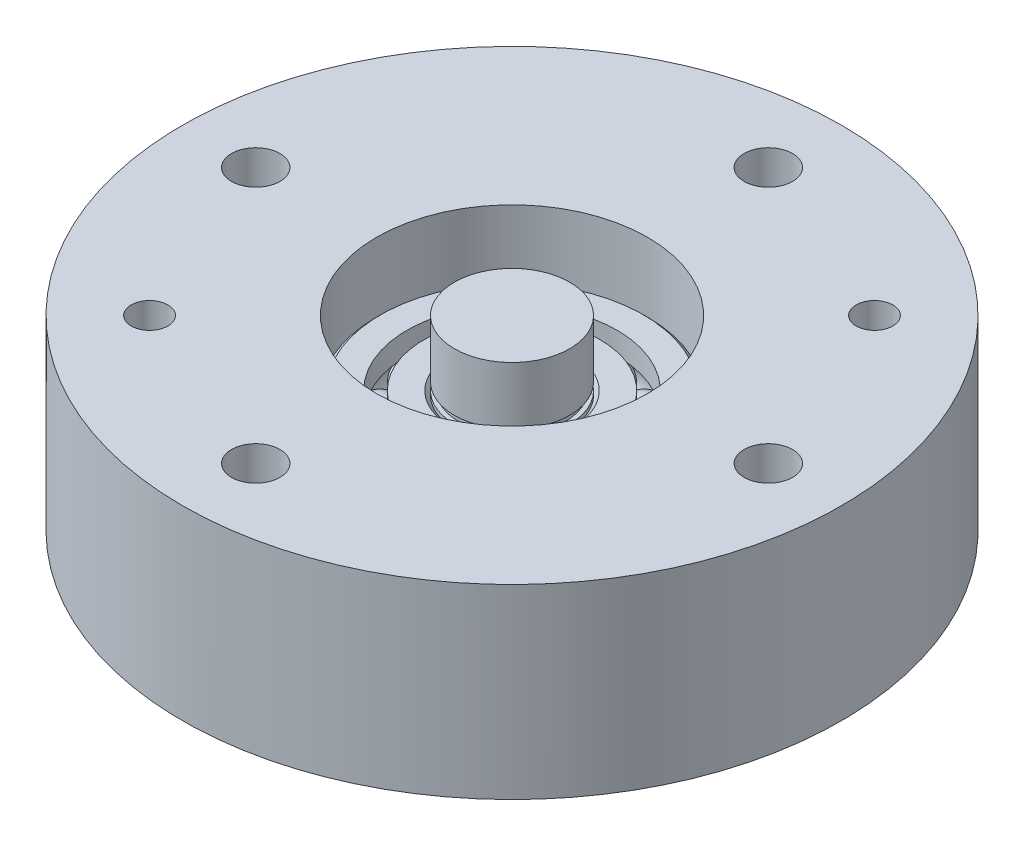
ISO-10303-21;
HEADER;
FILE_DESCRIPTION(('STEP AP214'),'2;1');
FILE_NAME('part.step','',(''),(''),'','','');
FILE_SCHEMA(('AUTOMOTIVE_DESIGN { 1 0 10303 214 1 1 1 1 }'));
ENDSEC;
DATA;
#1=APPLICATION_CONTEXT('core data for automotive mechanical design processes');
#2=APPLICATION_PROTOCOL_DEFINITION('international standard','automotive_design',2000,#1);
#3=PRODUCT_CONTEXT('',#1,'mechanical');
#4=PRODUCT('Part','Part','',(#3));
#5=PRODUCT_RELATED_PRODUCT_CATEGORY('part','',(#4));
#6=PRODUCT_DEFINITION_FORMATION('','',#4);
#7=PRODUCT_DEFINITION_CONTEXT('part definition',#1,'design');
#8=PRODUCT_DEFINITION('design','',#6,#7);
#9=PRODUCT_DEFINITION_SHAPE('','',#8);
#10=(LENGTH_UNIT() NAMED_UNIT(*) SI_UNIT(.MILLI.,.METRE.));
#11=(NAMED_UNIT(*) PLANE_ANGLE_UNIT() SI_UNIT($,.RADIAN.));
#12=(NAMED_UNIT(*) SI_UNIT($,.STERADIAN.) SOLID_ANGLE_UNIT());
#13=UNCERTAINTY_MEASURE_WITH_UNIT(LENGTH_MEASURE(1.E-05),#10,'distance_accuracy_value','');
#14=(GEOMETRIC_REPRESENTATION_CONTEXT(3) GLOBAL_UNCERTAINTY_ASSIGNED_CONTEXT((#13)) GLOBAL_UNIT_ASSIGNED_CONTEXT((#10,
#11,#12)) REPRESENTATION_CONTEXT('',''));
#15=CARTESIAN_POINT('',(0.,0.,0.));
#16=DIRECTION('',(0.,0.,1.));
#17=DIRECTION('',(1.,0.,0.));
#18=AXIS2_PLACEMENT_3D('',#15,#16,#17);
#19=CARTESIAN_POINT('',(0.,-53.5842712474619,0.));
#20=DIRECTION('',(0.,1.,0.));
#21=DIRECTION('',(0.,0.,1.));
#22=AXIS2_PLACEMENT_3D('',#19,#20,#21);
#23=CYLINDRICAL_SURFACE('',#22,10.);
#24=CARTESIAN_POINT('',(0.,-25.3,0.));
#25=DIRECTION('',(0.,1.,0.));
#26=DIRECTION('',(0.,0.,1.));
#27=AXIS2_PLACEMENT_3D('',#24,#25,#26);
#28=CIRCLE('',#27,10.);
#29=CARTESIAN_POINT('',(0.,-25.3,10.));
#30=VERTEX_POINT('',#29);
#31=EDGE_CURVE('E11',#30,#30,#28,.F.);
#32=ORIENTED_EDGE('',*,*,#31,.F.);
#33=EDGE_LOOP('',(#32));
#34=FACE_BOUND('',#33,.T.);
#35=CARTESIAN_POINT('',(0.,-11.3,0.));
#36=DIRECTION('',(0.,1.,0.));
#37=DIRECTION('',(0.,0.,1.));
#38=AXIS2_PLACEMENT_3D('',#35,#36,#37);
#39=CIRCLE('',#38,10.);
#40=CARTESIAN_POINT('',(0.,-11.3,10.));
#41=VERTEX_POINT('',#40);
#42=EDGE_CURVE('E48',#41,#41,#39,.T.);
#43=ORIENTED_EDGE('',*,*,#42,.F.);
#44=EDGE_LOOP('',(#43));
#45=FACE_BOUND('',#44,.T.);
#46=ADVANCED_FACE('F42',(#34,#45),#23,.T.);
#47=CARTESIAN_POINT('',(0.,-11.3,0.));
#48=DIRECTION('',(0.,1.,0.));
#49=DIRECTION('',(0.,0.,1.));
#50=AXIS2_PLACEMENT_3D('',#47,#48,#49);
#51=PLANE('',#50);
#52=CARTESIAN_POINT('',(0.,-11.3,0.));
#53=DIRECTION('',(0.,1.,0.));
#54=DIRECTION('',(0.,0.,1.));
#55=AXIS2_PLACEMENT_3D('',#52,#53,#54);
#56=CIRCLE('',#55,9.25);
#57=CARTESIAN_POINT('',(0.,-11.3,9.25));
#58=VERTEX_POINT('',#57);
#59=EDGE_CURVE('E64',#58,#58,#56,.T.);
#60=ORIENTED_EDGE('',*,*,#59,.F.);
#61=EDGE_LOOP('',(#60));
#62=FACE_BOUND('',#61,.T.);
#63=ORIENTED_EDGE('',*,*,#42,.T.);
#64=EDGE_LOOP('',(#63));
#65=FACE_BOUND('',#64,.T.);
#66=ADVANCED_FACE('F93',(#62,#65),#51,.T.);
#67=CARTESIAN_POINT('',(0.,-63.5038671967512,0.));
#68=DIRECTION('',(0.,1.,0.));
#69=DIRECTION('',(0.,0.,1.));
#70=AXIS2_PLACEMENT_3D('',#67,#68,#69);
#71=CYLINDRICAL_SURFACE('',#70,12.8);
#72=CARTESIAN_POINT('',(0.,-25.3,0.));
#73=DIRECTION('',(0.,-1.,0.));
#74=DIRECTION('',(0.,0.,-1.));
#75=AXIS2_PLACEMENT_3D('',#72,#73,#74);
#76=CIRCLE('',#75,12.8);
#77=CARTESIAN_POINT('',(0.,-25.3,-12.8));
#78=VERTEX_POINT('',#77);
#79=EDGE_CURVE('E56',#78,#78,#76,.T.);
#80=ORIENTED_EDGE('',*,*,#79,.T.);
#81=EDGE_LOOP('',(#80));
#82=FACE_BOUND('',#81,.T.);
#83=CARTESIAN_POINT('',(0.,-27.3,0.));
#84=DIRECTION('',(0.,-1.,0.));
#85=DIRECTION('',(0.,0.,-1.));
#86=AXIS2_PLACEMENT_3D('',#83,#84,#85);
#87=CIRCLE('',#86,12.8);
#88=CARTESIAN_POINT('',(0.,-27.3,-12.8));
#89=VERTEX_POINT('',#88);
#90=EDGE_CURVE('E52',#89,#89,#87,.T.);
#91=ORIENTED_EDGE('',*,*,#90,.F.);
#92=EDGE_LOOP('',(#91));
#93=FACE_BOUND('',#92,.T.);
#94=ADVANCED_FACE('F91',(#82,#93),#71,.T.);
#95=CARTESIAN_POINT('',(0.,-25.3,0.));
#96=DIRECTION('',(0.,-1.,0.));
#97=DIRECTION('',(0.,0.,-1.));
#98=AXIS2_PLACEMENT_3D('',#95,#96,#97);
#99=PLANE('',#98);
#100=ORIENTED_EDGE('',*,*,#31,.T.);
#101=EDGE_LOOP('',(#100));
#102=FACE_BOUND('',#101,.T.);
#103=ORIENTED_EDGE('',*,*,#79,.F.);
#104=EDGE_LOOP('',(#103));
#105=FACE_BOUND('',#104,.T.);
#106=ADVANCED_FACE('F87',(#102,#105),#99,.F.);
#107=CARTESIAN_POINT('',(0.,-27.3,0.));
#108=DIRECTION('',(0.,-1.,0.));
#109=DIRECTION('',(0.,0.,-1.));
#110=AXIS2_PLACEMENT_3D('',#107,#108,#109);
#111=PLANE('',#110);
#112=CARTESIAN_POINT('',(0.,-27.3,0.));
#113=DIRECTION('',(0.,-1.,0.));
#114=DIRECTION('',(0.,0.,-1.));
#115=AXIS2_PLACEMENT_3D('',#112,#113,#114);
#116=CIRCLE('',#115,7.75);
#117=CARTESIAN_POINT('',(0.,-27.3,-7.75));
#118=VERTEX_POINT('',#117);
#119=EDGE_CURVE('E76',#118,#118,#116,.T.);
#120=ORIENTED_EDGE('',*,*,#119,.F.);
#121=EDGE_LOOP('',(#120));
#122=FACE_BOUND('',#121,.T.);
#123=ORIENTED_EDGE('',*,*,#90,.T.);
#124=EDGE_LOOP('',(#123));
#125=FACE_BOUND('',#124,.T.);
#126=ADVANCED_FACE('F83',(#122,#125),#111,.T.);
#127=CARTESIAN_POINT('',(0.,16.1629509039023,0.));
#128=DIRECTION('',(0.,-1.,0.));
#129=DIRECTION('',(0.,0.,-1.));
#130=AXIS2_PLACEMENT_3D('',#127,#128,#129);
#131=CYLINDRICAL_SURFACE('',#130,9.25);
#132=ORIENTED_EDGE('',*,*,#59,.T.);
#133=EDGE_LOOP('',(#132));
#134=FACE_BOUND('',#133,.T.);
#135=CARTESIAN_POINT('',(0.,-10.,0.));
#136=DIRECTION('',(0.,1.,0.));
#137=DIRECTION('',(0.,0.,1.));
#138=AXIS2_PLACEMENT_3D('',#135,#136,#137);
#139=CIRCLE('',#138,9.25);
#140=CARTESIAN_POINT('',(0.,-10.,9.25));
#141=VERTEX_POINT('',#140);
#142=EDGE_CURVE('E61',#141,#141,#139,.T.);
#143=ORIENTED_EDGE('',*,*,#142,.F.);
#144=EDGE_LOOP('',(#143));
#145=FACE_BOUND('',#144,.T.);
#146=ADVANCED_FACE('F86',(#134,#145),#131,.T.);
#147=CARTESIAN_POINT('',(0.,28.2842712474619,0.));
#148=DIRECTION('',(0.,-1.,0.));
#149=DIRECTION('',(0.,0.,-1.));
#150=AXIS2_PLACEMENT_3D('',#147,#148,#149);
#151=CYLINDRICAL_SURFACE('',#150,10.);
#152=CARTESIAN_POINT('',(0.,-10.,0.));
#153=DIRECTION('',(0.,1.,0.));
#154=DIRECTION('',(0.,0.,1.));
#155=AXIS2_PLACEMENT_3D('',#152,#153,#154);
#156=CIRCLE('',#155,10.);
#157=CARTESIAN_POINT('',(0.,-10.,10.));
#158=VERTEX_POINT('',#157);
#159=EDGE_CURVE('E70',#158,#158,#156,.T.);
#160=ORIENTED_EDGE('',*,*,#159,.T.);
#161=EDGE_LOOP('',(#160));
#162=FACE_BOUND('',#161,.T.);
#163=CARTESIAN_POINT('',(0.,0.,0.));
#164=DIRECTION('',(0.,1.,0.));
#165=DIRECTION('',(0.,0.,1.));
#166=AXIS2_PLACEMENT_3D('',#163,#164,#165);
#167=CIRCLE('',#166,10.);
#168=CARTESIAN_POINT('',(0.,0.,10.));
#169=VERTEX_POINT('',#168);
#170=EDGE_CURVE('E67',#169,#169,#167,.T.);
#171=ORIENTED_EDGE('',*,*,#170,.F.);
#172=EDGE_LOOP('',(#171));
#173=FACE_BOUND('',#172,.T.);
#174=ADVANCED_FACE('F124',(#162,#173),#151,.T.);
#175=CARTESIAN_POINT('',(0.,-10.,0.));
#176=DIRECTION('',(0.,1.,0.));
#177=DIRECTION('',(0.,0.,1.));
#178=AXIS2_PLACEMENT_3D('',#175,#176,#177);
#179=PLANE('',#178);
#180=ORIENTED_EDGE('',*,*,#142,.T.);
#181=EDGE_LOOP('',(#180));
#182=FACE_BOUND('',#181,.T.);
#183=ORIENTED_EDGE('',*,*,#159,.F.);
#184=EDGE_LOOP('',(#183));
#185=FACE_BOUND('',#184,.T.);
#186=ADVANCED_FACE('F135',(#182,#185),#179,.F.);
#187=CARTESIAN_POINT('',(0.,0.,0.));
#188=DIRECTION('',(0.,1.,0.));
#189=DIRECTION('',(0.,0.,1.));
#190=AXIS2_PLACEMENT_3D('',#187,#188,#189);
#191=PLANE('',#190);
#192=ORIENTED_EDGE('',*,*,#170,.T.);
#193=EDGE_LOOP('',(#192));
#194=FACE_BOUND('',#193,.T.);
#195=ADVANCED_FACE('F145',(#194),#191,.T.);
#196=CARTESIAN_POINT('',(0.,-56.220310216783,0.));
#197=DIRECTION('',(0.,1.,0.));
#198=DIRECTION('',(0.,0.,1.));
#199=AXIS2_PLACEMENT_3D('',#196,#197,#198);
#200=CYLINDRICAL_SURFACE('',#199,7.75);
#201=ORIENTED_EDGE('',*,*,#119,.T.);
#202=EDGE_LOOP('',(#201));
#203=FACE_BOUND('',#202,.T.);
#204=CARTESIAN_POINT('',(0.,-34.3,0.));
#205=DIRECTION('',(0.,-1.,0.));
#206=DIRECTION('',(0.,0.,-1.));
#207=AXIS2_PLACEMENT_3D('',#204,#205,#206);
#208=CIRCLE('',#207,7.75);
#209=CARTESIAN_POINT('',(0.,-34.3,-7.75));
#210=VERTEX_POINT('',#209);
#211=EDGE_CURVE('E73',#210,#210,#208,.T.);
#212=ORIENTED_EDGE('',*,*,#211,.F.);
#213=EDGE_LOOP('',(#212));
#214=FACE_BOUND('',#213,.T.);
#215=ADVANCED_FACE('F80',(#203,#214),#200,.T.);
#216=CARTESIAN_POINT('',(0.,-34.3,0.));
#217=DIRECTION('',(0.,-1.,0.));
#218=DIRECTION('',(0.,0.,-1.));
#219=AXIS2_PLACEMENT_3D('',#216,#217,#218);
#220=PLANE('',#219);
#221=ORIENTED_EDGE('',*,*,#211,.T.);
#222=EDGE_LOOP('',(#221));
#223=FACE_BOUND('',#222,.T.);
#224=ADVANCED_FACE('F169',(#223),#220,.T.);
#225=CLOSED_SHELL('',(#46,#66,#94,#106,#126,#146,#174,#186,#195,#215,#224));
#226=MANIFOLD_SOLID_BREP('B2',#225);
#227=CARTESIAN_POINT('',(-8.37499999999981,-18.3,-14.5059255133895));
#228=DIRECTION('',(0.,1.,0.));
#229=DIRECTION('',(-0.499999999999989,0.,-0.866025403784445));
#230=AXIS2_PLACEMENT_3D('',#227,#228,#229);
#231=SPHERICAL_SURFACE('',#230,3.43265291781274);
#232=CARTESIAN_POINT('',(-8.37499999999981,-14.8673470821873,-14.5059255133895));
#233=VERTEX_POINT('',#232);
#234=VERTEX_LOOP('',#233);
#235=FACE_BOUND('',#234,.T.);
#236=ADVANCED_FACE('F209',(#235),#231,.T.);
#237=CLOSED_SHELL('',(#236));
#238=MANIFOLD_SOLID_BREP('B6',#237);
#239=CARTESIAN_POINT('',(-14.5059255133893,-18.3,-8.37500000000017));
#240=DIRECTION('',(0.,1.,0.));
#241=DIRECTION('',(-0.866025403784433,0.,-0.50000000000001));
#242=AXIS2_PLACEMENT_3D('',#239,#240,#241);
#243=SPHERICAL_SURFACE('',#242,3.43265291781274);
#244=CARTESIAN_POINT('',(-14.5059255133893,-14.8673470821873,-8.37500000000017));
#245=VERTEX_POINT('',#244);
#246=VERTEX_LOOP('',#245);
#247=FACE_BOUND('',#246,.T.);
#248=ADVANCED_FACE('F230',(#247),#243,.T.);
#249=CLOSED_SHELL('',(#248));
#250=MANIFOLD_SOLID_BREP('B38',#249);
#251=CARTESIAN_POINT('',(-16.75,-18.3,-1.80411241501588E-13));
#252=DIRECTION('',(0.,1.,0.));
#253=DIRECTION('',(-1.,0.,0.));
#254=AXIS2_PLACEMENT_3D('',#251,#252,#253);
#255=SPHERICAL_SURFACE('',#254,3.43265291781274);
#256=CARTESIAN_POINT('',(-16.75,-14.8673470821873,-1.80411241501588E-13));
#257=VERTEX_POINT('',#256);
#258=VERTEX_LOOP('',#257);
#259=FACE_BOUND('',#258,.T.);
#260=ADVANCED_FACE('F251',(#259),#255,.T.);
#261=CLOSED_SHELL('',(#260));
#262=MANIFOLD_SOLID_BREP('B205',#261);
#263=CARTESIAN_POINT('',(-14.5059255133894,-18.3,8.37499999999987));
#264=DIRECTION('',(0.,1.,0.));
#265=DIRECTION('',(-0.866025403784443,0.,0.499999999999992));
#266=AXIS2_PLACEMENT_3D('',#263,#264,#265);
#267=SPHERICAL_SURFACE('',#266,3.43265291781274);
#268=CARTESIAN_POINT('',(-14.5059255133894,-14.8673470821873,8.37499999999987));
#269=VERTEX_POINT('',#268);
#270=VERTEX_LOOP('',#269);
#271=FACE_BOUND('',#270,.T.);
#272=ADVANCED_FACE('F272',(#271),#267,.T.);
#273=CLOSED_SHELL('',(#272));
#274=MANIFOLD_SOLID_BREP('B226',#273);
#275=CARTESIAN_POINT('',(-8.37500000000012,-18.3,14.5059255133893));
#276=DIRECTION('',(0.,1.,0.));
#277=DIRECTION('',(-0.500000000000007,0.,0.866025403784435));
#278=AXIS2_PLACEMENT_3D('',#275,#276,#277);
#279=SPHERICAL_SURFACE('',#278,3.43265291781274);
#280=CARTESIAN_POINT('',(-8.37500000000012,-14.8673470821873,14.5059255133893));
#281=VERTEX_POINT('',#280);
#282=VERTEX_LOOP('',#281);
#283=FACE_BOUND('',#282,.T.);
#284=ADVANCED_FACE('F293',(#283),#279,.T.);
#285=CLOSED_SHELL('',(#284));
#286=MANIFOLD_SOLID_BREP('B247',#285);
#287=CARTESIAN_POINT('',(-1.17961196366423E-13,-18.3,16.75));
#288=DIRECTION('',(0.,1.,0.));
#289=DIRECTION('',(0.,0.,1.));
#290=AXIS2_PLACEMENT_3D('',#287,#288,#289);
#291=SPHERICAL_SURFACE('',#290,3.43265291781274);
#292=CARTESIAN_POINT('',(-1.17961196366423E-13,-14.8673470821873,16.75));
#293=VERTEX_POINT('',#292);
#294=VERTEX_LOOP('',#293);
#295=FACE_BOUND('',#294,.T.);
#296=ADVANCED_FACE('F314',(#295),#291,.T.);
#297=CLOSED_SHELL('',(#296));
#298=MANIFOLD_SOLID_BREP('B268',#297);
#299=CARTESIAN_POINT('',(8.37499999999992,-18.3,14.5059255133894));
#300=DIRECTION('',(0.,1.,0.));
#301=DIRECTION('',(0.499999999999995,0.,0.866025403784442));
#302=AXIS2_PLACEMENT_3D('',#299,#300,#301);
#303=SPHERICAL_SURFACE('',#302,3.43265291781274);
#304=CARTESIAN_POINT('',(8.37499999999992,-14.8673470821873,14.5059255133894));
#305=VERTEX_POINT('',#304);
#306=VERTEX_LOOP('',#305);
#307=FACE_BOUND('',#306,.T.);
#308=ADVANCED_FACE('F335',(#307),#303,.T.);
#309=CLOSED_SHELL('',(#308));
#310=MANIFOLD_SOLID_BREP('B289',#309);
#311=CARTESIAN_POINT('',(14.5059255133893,-18.3,8.37500000000008));
#312=DIRECTION('',(0.,1.,0.));
#313=DIRECTION('',(0.866025403784436,0.,0.500000000000004));
#314=AXIS2_PLACEMENT_3D('',#311,#312,#313);
#315=SPHERICAL_SURFACE('',#314,3.43265291781274);
#316=CARTESIAN_POINT('',(14.5059255133893,-14.8673470821873,8.37500000000008));
#317=VERTEX_POINT('',#316);
#318=VERTEX_LOOP('',#317);
#319=FACE_BOUND('',#318,.T.);
#320=ADVANCED_FACE('F356',(#319),#315,.T.);
#321=CLOSED_SHELL('',(#320));
#322=MANIFOLD_SOLID_BREP('B310',#321);
#323=CARTESIAN_POINT('',(16.75,-18.3,0.));
#324=DIRECTION('',(0.,1.,0.));
#325=DIRECTION('',(1.,0.,0.));
#326=AXIS2_PLACEMENT_3D('',#323,#324,#325);
#327=SPHERICAL_SURFACE('',#326,3.43265291781274);
#328=CARTESIAN_POINT('',(16.75,-14.8673470821873,0.));
#329=VERTEX_POINT('',#328);
#330=VERTEX_LOOP('',#329);
#331=FACE_BOUND('',#330,.T.);
#332=ADVANCED_FACE('F377',(#331),#327,.T.);
#333=CLOSED_SHELL('',(#332));
#334=MANIFOLD_SOLID_BREP('B331',#333);
#335=CARTESIAN_POINT('',(14.5059255133894,-18.3,-8.37499999999997));
#336=DIRECTION('',(0.,1.,0.));
#337=DIRECTION('',(0.86602540378444,0.,-0.499999999999998));
#338=AXIS2_PLACEMENT_3D('',#335,#336,#337);
#339=SPHERICAL_SURFACE('',#338,3.43265291781274);
#340=CARTESIAN_POINT('',(14.5059255133894,-14.8673470821873,-8.37499999999997));
#341=VERTEX_POINT('',#340);
#342=VERTEX_LOOP('',#341);
#343=FACE_BOUND('',#342,.T.);
#344=ADVANCED_FACE('F398',(#343),#339,.T.);
#345=CLOSED_SHELL('',(#344));
#346=MANIFOLD_SOLID_BREP('B352',#345);
#347=CARTESIAN_POINT('',(8.37500000000002,-18.3,-14.5059255133893));
#348=DIRECTION('',(0.,1.,0.));
#349=DIRECTION('',(0.500000000000001,0.,-0.866025403784438));
#350=AXIS2_PLACEMENT_3D('',#347,#348,#349);
#351=SPHERICAL_SURFACE('',#350,3.43265291781274);
#352=CARTESIAN_POINT('',(8.37500000000002,-14.8673470821873,-14.5059255133893));
#353=VERTEX_POINT('',#352);
#354=VERTEX_LOOP('',#353);
#355=FACE_BOUND('',#354,.T.);
#356=ADVANCED_FACE('F419',(#355),#351,.T.);
#357=CLOSED_SHELL('',(#356));
#358=MANIFOLD_SOLID_BREP('B373',#357);
#359=CARTESIAN_POINT('',(0.,-18.3,-16.75));
#360=DIRECTION('',(0.,1.,0.));
#361=DIRECTION('',(0.,0.,-1.));
#362=AXIS2_PLACEMENT_3D('',#359,#360,#361);
#363=SPHERICAL_SURFACE('',#362,3.43265291781274);
#364=CARTESIAN_POINT('',(0.,-14.8673470821873,-16.75));
#365=VERTEX_POINT('',#364);
#366=VERTEX_LOOP('',#365);
#367=FACE_BOUND('',#366,.T.);
#368=ADVANCED_FACE('F442',(#367),#363,.T.);
#369=CLOSED_SHELL('',(#368));
#370=MANIFOLD_SOLID_BREP('B394',#369);
#371=CARTESIAN_POINT('',(0.,-11.3,-15.2994505494505));
#372=DIRECTION('',(0.,-1.,0.));
#373=DIRECTION('',(-1.,0.,0.));
#374=AXIS2_PLACEMENT_3D('',#371,#372,#373);
#375=PLANE('',#374);
#376=CARTESIAN_POINT('',(0.,-11.3,0.));
#377=DIRECTION('',(0.,1.,0.));
#378=DIRECTION('',(1.,0.,0.));
#379=AXIS2_PLACEMENT_3D('',#376,#377,#378);
#380=CIRCLE('',#379,10.7);
#381=CARTESIAN_POINT('',(10.7,-11.3,0.));
#382=VERTEX_POINT('',#381);
#383=EDGE_CURVE('E491',#382,#382,#380,.T.);
#384=ORIENTED_EDGE('',*,*,#383,.F.);
#385=EDGE_LOOP('',(#384));
#386=FACE_BOUND('',#385,.T.);
#387=CARTESIAN_POINT('',(0.,-11.3,0.));
#388=DIRECTION('',(0.,1.,0.));
#389=DIRECTION('',(1.,0.,0.));
#390=AXIS2_PLACEMENT_3D('',#387,#388,#389);
#391=CIRCLE('',#390,15.2994505494506);
#392=CARTESIAN_POINT('',(15.2994505494506,-11.3,0.));
#393=VERTEX_POINT('',#392);
#394=EDGE_CURVE('E441',#393,#393,#391,.T.);
#395=ORIENTED_EDGE('',*,*,#394,.T.);
#396=EDGE_LOOP('',(#395));
#397=FACE_BOUND('',#396,.T.);
#398=ADVANCED_FACE('F463',(#386,#397),#375,.F.);
#399=CARTESIAN_POINT('',(0.,-11.3,0.));
#400=DIRECTION('',(0.,1.,0.));
#401=DIRECTION('',(1.,0.,0.));
#402=AXIS2_PLACEMENT_3D('',#399,#400,#401);
#403=CYLINDRICAL_SURFACE('',#402,15.2994505494506);
#404=ORIENTED_EDGE('',*,*,#394,.F.);
#405=EDGE_LOOP('',(#404));
#406=FACE_BOUND('',#405,.T.);
#407=CARTESIAN_POINT('',(0.,-15.1888888888889,0.));
#408=DIRECTION('',(0.,1.,0.));
#409=DIRECTION('',(1.,0.,0.));
#410=AXIS2_PLACEMENT_3D('',#407,#408,#409);
#411=CIRCLE('',#410,15.2994505494506);
#412=CARTESIAN_POINT('',(15.2994505494506,-15.1888888888889,0.));
#413=VERTEX_POINT('',#412);
#414=EDGE_CURVE('E469',#413,#413,#411,.T.);
#415=ORIENTED_EDGE('',*,*,#414,.T.);
#416=EDGE_LOOP('',(#415));
#417=FACE_BOUND('',#416,.T.);
#418=ADVANCED_FACE('F498',(#406,#417),#403,.T.);
#419=CARTESIAN_POINT('',(0.,-18.3,0.));
#420=DIRECTION('',(0.,1.,0.));
#421=DIRECTION('',(1.,0.,0.));
#422=AXIS2_PLACEMENT_3D('',#419,#420,#421);
#423=TOROIDAL_SURFACE('',#422,16.75,3.43265291781274);
#424=ORIENTED_EDGE('',*,*,#414,.F.);
#425=EDGE_LOOP('',(#424));
#426=FACE_BOUND('',#425,.T.);
#427=CARTESIAN_POINT('',(0.,-21.4111111111111,0.));
#428=DIRECTION('',(0.,1.,0.));
#429=DIRECTION('',(1.,0.,0.));
#430=AXIS2_PLACEMENT_3D('',#427,#428,#429);
#431=CIRCLE('',#430,15.2994505494505);
#432=CARTESIAN_POINT('',(15.2994505494505,-21.4111111111111,0.));
#433=VERTEX_POINT('',#432);
#434=EDGE_CURVE('E473',#433,#433,#431,.T.);
#435=ORIENTED_EDGE('',*,*,#434,.T.);
#436=EDGE_LOOP('',(#435));
#437=FACE_BOUND('',#436,.T.);
#438=ADVANCED_FACE('F502',(#426,#437),#423,.F.);
#439=CARTESIAN_POINT('',(0.,-11.3,0.));
#440=DIRECTION('',(0.,1.,0.));
#441=DIRECTION('',(1.,0.,0.));
#442=AXIS2_PLACEMENT_3D('',#439,#440,#441);
#443=CYLINDRICAL_SURFACE('',#442,15.2994505494506);
#444=ORIENTED_EDGE('',*,*,#434,.F.);
#445=EDGE_LOOP('',(#444));
#446=FACE_BOUND('',#445,.T.);
#447=CARTESIAN_POINT('',(0.,-25.3,0.));
#448=DIRECTION('',(0.,1.,0.));
#449=DIRECTION('',(1.,0.,0.));
#450=AXIS2_PLACEMENT_3D('',#447,#448,#449);
#451=CIRCLE('',#450,15.2994505494506);
#452=CARTESIAN_POINT('',(15.2994505494506,-25.3,0.));
#453=VERTEX_POINT('',#452);
#454=EDGE_CURVE('E477',#453,#453,#451,.T.);
#455=ORIENTED_EDGE('',*,*,#454,.T.);
#456=EDGE_LOOP('',(#455));
#457=FACE_BOUND('',#456,.T.);
#458=ADVANCED_FACE('F507',(#446,#457),#443,.T.);
#459=CARTESIAN_POINT('',(0.,-25.3,-10.7));
#460=DIRECTION('',(0.,1.,0.));
#461=DIRECTION('',(1.,0.,0.));
#462=AXIS2_PLACEMENT_3D('',#459,#460,#461);
#463=PLANE('',#462);
#464=ORIENTED_EDGE('',*,*,#454,.F.);
#465=EDGE_LOOP('',(#464));
#466=FACE_BOUND('',#465,.T.);
#467=CARTESIAN_POINT('',(0.,-25.3,0.));
#468=DIRECTION('',(0.,1.,0.));
#469=DIRECTION('',(1.,0.,0.));
#470=AXIS2_PLACEMENT_3D('',#467,#468,#469);
#471=CIRCLE('',#470,10.7);
#472=CARTESIAN_POINT('',(10.7,-25.3,0.));
#473=VERTEX_POINT('',#472);
#474=EDGE_CURVE('E482',#473,#473,#471,.T.);
#475=ORIENTED_EDGE('',*,*,#474,.T.);
#476=EDGE_LOOP('',(#475));
#477=FACE_BOUND('',#476,.T.);
#478=ADVANCED_FACE('F513',(#466,#477),#463,.F.);
#479=CARTESIAN_POINT('',(0.,-24.6,0.));
#480=DIRECTION('',(0.,-1.,0.));
#481=DIRECTION('',(-1.,0.,0.));
#482=AXIS2_PLACEMENT_3D('',#479,#480,#481);
#483=CONICAL_SURFACE('',#482,10.,0.78539816339745);
#484=ORIENTED_EDGE('',*,*,#474,.F.);
#485=EDGE_LOOP('',(#484));
#486=FACE_BOUND('',#485,.T.);
#487=CARTESIAN_POINT('',(0.,-24.6,0.));
#488=DIRECTION('',(0.,1.,0.));
#489=DIRECTION('',(1.,0.,0.));
#490=AXIS2_PLACEMENT_3D('',#487,#488,#489);
#491=CIRCLE('',#490,10.);
#492=CARTESIAN_POINT('',(10.,-24.6,0.));
#493=VERTEX_POINT('',#492);
#494=EDGE_CURVE('E485',#493,#493,#491,.T.);
#495=ORIENTED_EDGE('',*,*,#494,.T.);
#496=EDGE_LOOP('',(#495));
#497=FACE_BOUND('',#496,.T.);
#498=ADVANCED_FACE('F517',(#486,#497),#483,.F.);
#499=CARTESIAN_POINT('',(0.,-11.3,0.));
#500=DIRECTION('',(0.,1.,0.));
#501=DIRECTION('',(1.,0.,0.));
#502=AXIS2_PLACEMENT_3D('',#499,#500,#501);
#503=CYLINDRICAL_SURFACE('',#502,10.);
#504=ORIENTED_EDGE('',*,*,#494,.F.);
#505=EDGE_LOOP('',(#504));
#506=FACE_BOUND('',#505,.T.);
#507=CARTESIAN_POINT('',(0.,-12.,0.));
#508=DIRECTION('',(0.,1.,0.));
#509=DIRECTION('',(1.,0.,0.));
#510=AXIS2_PLACEMENT_3D('',#507,#508,#509);
#511=CIRCLE('',#510,10.);
#512=CARTESIAN_POINT('',(10.,-12.,0.));
#513=VERTEX_POINT('',#512);
#514=EDGE_CURVE('E488',#513,#513,#511,.T.);
#515=ORIENTED_EDGE('',*,*,#514,.T.);
#516=EDGE_LOOP('',(#515));
#517=FACE_BOUND('',#516,.T.);
#518=ADVANCED_FACE('F521',(#506,#517),#503,.F.);
#519=CARTESIAN_POINT('',(0.,-11.3,0.));
#520=DIRECTION('',(0.,1.,0.));
#521=DIRECTION('',(1.,0.,0.));
#522=AXIS2_PLACEMENT_3D('',#519,#520,#521);
#523=CONICAL_SURFACE('',#522,10.7,0.785398163397447);
#524=ORIENTED_EDGE('',*,*,#514,.F.);
#525=EDGE_LOOP('',(#524));
#526=FACE_BOUND('',#525,.T.);
#527=ORIENTED_EDGE('',*,*,#383,.T.);
#528=EDGE_LOOP('',(#527));
#529=FACE_BOUND('',#528,.T.);
#530=ADVANCED_FACE('F495',(#526,#529),#523,.F.);
#531=CLOSED_SHELL('',(#398,#418,#438,#458,#478,#498,#518,#530));
#532=MANIFOLD_SOLID_BREP('B415',#531);
#533=CARTESIAN_POINT('',(0.,-12.,0.));
#534=DIRECTION('',(0.,-1.,0.));
#535=DIRECTION('',(-1.,0.,0.));
#536=AXIS2_PLACEMENT_3D('',#533,#534,#535);
#537=CONICAL_SURFACE('',#536,23.5,0.785398163397448);
#538=CARTESIAN_POINT('',(0.,-11.3,0.));
#539=DIRECTION('',(0.,1.,0.));
#540=DIRECTION('',(1.,0.,0.));
#541=AXIS2_PLACEMENT_3D('',#538,#539,#540);
#542=CIRCLE('',#541,22.8);
#543=CARTESIAN_POINT('',(22.8,-11.3,0.));
#544=VERTEX_POINT('',#543);
#545=EDGE_CURVE('E620',#544,#544,#542,.T.);
#546=ORIENTED_EDGE('',*,*,#545,.F.);
#547=EDGE_LOOP('',(#546));
#548=FACE_BOUND('',#547,.T.);
#549=CARTESIAN_POINT('',(0.,-12.,0.));
#550=DIRECTION('',(0.,1.,0.));
#551=DIRECTION('',(1.,0.,0.));
#552=AXIS2_PLACEMENT_3D('',#549,#550,#551);
#553=CIRCLE('',#552,23.5);
#554=CARTESIAN_POINT('',(23.5,-12.,0.));
#555=VERTEX_POINT('',#554);
#556=EDGE_CURVE('E462',#555,#555,#553,.T.);
#557=ORIENTED_EDGE('',*,*,#556,.T.);
#558=EDGE_LOOP('',(#557));
#559=FACE_BOUND('',#558,.T.);
#560=ADVANCED_FACE('F592',(#548,#559),#537,.T.);
#561=CARTESIAN_POINT('',(0.,-11.3,0.));
#562=DIRECTION('',(0.,1.,0.));
#563=DIRECTION('',(1.,0.,0.));
#564=AXIS2_PLACEMENT_3D('',#561,#562,#563);
#565=CYLINDRICAL_SURFACE('',#564,23.5);
#566=ORIENTED_EDGE('',*,*,#556,.F.);
#567=EDGE_LOOP('',(#566));
#568=FACE_BOUND('',#567,.T.);
#569=CARTESIAN_POINT('',(0.,-24.6,0.));
#570=DIRECTION('',(0.,1.,0.));
#571=DIRECTION('',(1.,0.,0.));
#572=AXIS2_PLACEMENT_3D('',#569,#570,#571);
#573=CIRCLE('',#572,23.5);
#574=CARTESIAN_POINT('',(23.5,-24.6,0.));
#575=VERTEX_POINT('',#574);
#576=EDGE_CURVE('E598',#575,#575,#573,.T.);
#577=ORIENTED_EDGE('',*,*,#576,.T.);
#578=EDGE_LOOP('',(#577));
#579=FACE_BOUND('',#578,.T.);
#580=ADVANCED_FACE('F627',(#568,#579),#565,.T.);
#581=CARTESIAN_POINT('',(0.,-25.3,0.));
#582=DIRECTION('',(0.,1.,0.));
#583=DIRECTION('',(1.,0.,0.));
#584=AXIS2_PLACEMENT_3D('',#581,#582,#583);
#585=CONICAL_SURFACE('',#584,22.8,0.785398163397448);
#586=ORIENTED_EDGE('',*,*,#576,.F.);
#587=EDGE_LOOP('',(#586));
#588=FACE_BOUND('',#587,.T.);
#589=CARTESIAN_POINT('',(0.,-25.3,0.));
#590=DIRECTION('',(0.,1.,0.));
#591=DIRECTION('',(1.,0.,0.));
#592=AXIS2_PLACEMENT_3D('',#589,#590,#591);
#593=CIRCLE('',#592,22.8);
#594=CARTESIAN_POINT('',(22.8,-25.3,0.));
#595=VERTEX_POINT('',#594);
#596=EDGE_CURVE('E602',#595,#595,#593,.T.);
#597=ORIENTED_EDGE('',*,*,#596,.T.);
#598=EDGE_LOOP('',(#597));
#599=FACE_BOUND('',#598,.T.);
#600=ADVANCED_FACE('F631',(#588,#599),#585,.T.);
#601=CARTESIAN_POINT('',(0.,-25.3,-22.8));
#602=DIRECTION('',(0.,1.,0.));
#603=DIRECTION('',(1.,0.,0.));
#604=AXIS2_PLACEMENT_3D('',#601,#602,#603);
#605=PLANE('',#604);
#606=ORIENTED_EDGE('',*,*,#596,.F.);
#607=EDGE_LOOP('',(#606));
#608=FACE_BOUND('',#607,.T.);
#609=CARTESIAN_POINT('',(0.,-25.3,0.));
#610=DIRECTION('',(0.,1.,0.));
#611=DIRECTION('',(1.,0.,0.));
#612=AXIS2_PLACEMENT_3D('',#609,#610,#611);
#613=CIRCLE('',#612,18.2005494505494);
#614=CARTESIAN_POINT('',(18.2005494505494,-25.3,0.));
#615=VERTEX_POINT('',#614);
#616=EDGE_CURVE('E606',#615,#615,#613,.T.);
#617=ORIENTED_EDGE('',*,*,#616,.T.);
#618=EDGE_LOOP('',(#617));
#619=FACE_BOUND('',#618,.T.);
#620=ADVANCED_FACE('F636',(#608,#619),#605,.F.);
#621=CARTESIAN_POINT('',(0.,-11.3,0.));
#622=DIRECTION('',(0.,1.,0.));
#623=DIRECTION('',(1.,0.,0.));
#624=AXIS2_PLACEMENT_3D('',#621,#622,#623);
#625=CYLINDRICAL_SURFACE('',#624,18.2005494505494);
#626=ORIENTED_EDGE('',*,*,#616,.F.);
#627=EDGE_LOOP('',(#626));
#628=FACE_BOUND('',#627,.T.);
#629=CARTESIAN_POINT('',(0.,-21.4111111111111,0.));
#630=DIRECTION('',(0.,1.,0.));
#631=DIRECTION('',(1.,0.,0.));
#632=AXIS2_PLACEMENT_3D('',#629,#630,#631);
#633=CIRCLE('',#632,18.2005494505495);
#634=CARTESIAN_POINT('',(18.2005494505495,-21.4111111111111,0.));
#635=VERTEX_POINT('',#634);
#636=EDGE_CURVE('E611',#635,#635,#633,.T.);
#637=ORIENTED_EDGE('',*,*,#636,.T.);
#638=EDGE_LOOP('',(#637));
#639=FACE_BOUND('',#638,.T.);
#640=ADVANCED_FACE('F642',(#628,#639),#625,.F.);
#641=CARTESIAN_POINT('',(0.,-18.3,0.));
#642=DIRECTION('',(0.,1.,0.));
#643=DIRECTION('',(1.,0.,0.));
#644=AXIS2_PLACEMENT_3D('',#641,#642,#643);
#645=TOROIDAL_SURFACE('',#644,16.75,3.43265291781274);
#646=ORIENTED_EDGE('',*,*,#636,.F.);
#647=EDGE_LOOP('',(#646));
#648=FACE_BOUND('',#647,.T.);
#649=CARTESIAN_POINT('',(0.,-15.1888888888889,0.));
#650=DIRECTION('',(0.,1.,0.));
#651=DIRECTION('',(1.,0.,0.));
#652=AXIS2_PLACEMENT_3D('',#649,#650,#651);
#653=CIRCLE('',#652,18.2005494505495);
#654=CARTESIAN_POINT('',(18.2005494505495,-15.1888888888889,0.));
#655=VERTEX_POINT('',#654);
#656=EDGE_CURVE('E614',#655,#655,#653,.T.);
#657=ORIENTED_EDGE('',*,*,#656,.T.);
#658=EDGE_LOOP('',(#657));
#659=FACE_BOUND('',#658,.T.);
#660=ADVANCED_FACE('F646',(#648,#659),#645,.F.);
#661=CARTESIAN_POINT('',(0.,-11.3,0.));
#662=DIRECTION('',(0.,1.,0.));
#663=DIRECTION('',(1.,0.,0.));
#664=AXIS2_PLACEMENT_3D('',#661,#662,#663);
#665=CYLINDRICAL_SURFACE('',#664,18.2005494505494);
#666=ORIENTED_EDGE('',*,*,#656,.F.);
#667=EDGE_LOOP('',(#666));
#668=FACE_BOUND('',#667,.T.);
#669=CARTESIAN_POINT('',(0.,-11.3,0.));
#670=DIRECTION('',(0.,1.,0.));
#671=DIRECTION('',(1.,0.,0.));
#672=AXIS2_PLACEMENT_3D('',#669,#670,#671);
#673=CIRCLE('',#672,18.2005494505494);
#674=CARTESIAN_POINT('',(18.2005494505494,-11.3,0.));
#675=VERTEX_POINT('',#674);
#676=EDGE_CURVE('E617',#675,#675,#673,.T.);
#677=ORIENTED_EDGE('',*,*,#676,.T.);
#678=EDGE_LOOP('',(#677));
#679=FACE_BOUND('',#678,.T.);
#680=ADVANCED_FACE('F650',(#668,#679),#665,.F.);
#681=CARTESIAN_POINT('',(0.,-11.3,-22.8));
#682=DIRECTION('',(0.,-1.,0.));
#683=DIRECTION('',(-1.,0.,0.));
#684=AXIS2_PLACEMENT_3D('',#681,#682,#683);
#685=PLANE('',#684);
#686=ORIENTED_EDGE('',*,*,#676,.F.);
#687=EDGE_LOOP('',(#686));
#688=FACE_BOUND('',#687,.T.);
#689=ORIENTED_EDGE('',*,*,#545,.T.);
#690=EDGE_LOOP('',(#689));
#691=FACE_BOUND('',#690,.T.);
#692=ADVANCED_FACE('F624',(#688,#691),#685,.F.);
#693=CLOSED_SHELL('',(#560,#580,#600,#620,#640,#660,#680,#692));
#694=MANIFOLD_SOLID_BREP('B436',#693);
#695=CARTESIAN_POINT('',(0.,-32.3,0.));
#696=DIRECTION('',(0.,-1.,0.));
#697=DIRECTION('',(0.,0.,-1.));
#698=AXIS2_PLACEMENT_3D('',#695,#696,#697);
#699=PLANE('',#698);
#700=CARTESIAN_POINT('',(31.430896423742,-32.3,-31.4308964237421));
#701=DIRECTION('',(0.,-1.,0.));
#702=DIRECTION('',(0.,0.,-1.));
#703=AXIS2_PLACEMENT_3D('',#700,#701,#702);
#704=CIRCLE('',#703,3.17499999999999);
#705=CARTESIAN_POINT('',(31.430896423742,-32.3,-34.6058964237421));
#706=VERTEX_POINT('',#705);
#707=EDGE_CURVE('E776',#706,#706,#704,.T.);
#708=ORIENTED_EDGE('',*,*,#707,.F.);
#709=EDGE_LOOP('',(#708));
#710=FACE_BOUND('',#709,.T.);
#711=CARTESIAN_POINT('',(-31.430896423742,-32.3,31.4308964237421));
#712=DIRECTION('',(0.,-1.,0.));
#713=DIRECTION('',(0.,0.,-1.));
#714=AXIS2_PLACEMENT_3D('',#711,#712,#713);
#715=CIRCLE('',#714,3.175);
#716=CARTESIAN_POINT('',(-31.430896423742,-32.3,28.2558964237421));
#717=VERTEX_POINT('',#716);
#718=EDGE_CURVE('E770',#717,#717,#715,.T.);
#719=ORIENTED_EDGE('',*,*,#718,.F.);
#720=EDGE_LOOP('',(#719));
#721=FACE_BOUND('',#720,.T.);
#722=CARTESIAN_POINT('',(-44.45,-32.3,0.));
#723=DIRECTION('',(0.,-1.,0.));
#724=DIRECTION('',(0.,0.,-1.));
#725=AXIS2_PLACEMENT_3D('',#722,#723,#724);
#726=CIRCLE('',#725,4.2);
#727=CARTESIAN_POINT('',(-44.45,-32.3,-4.2));
#728=VERTEX_POINT('',#727);
#729=EDGE_CURVE('E764',#728,#728,#726,.T.);
#730=ORIENTED_EDGE('',*,*,#729,.F.);
#731=EDGE_LOOP('',(#730));
#732=FACE_BOUND('',#731,.T.);
#733=CARTESIAN_POINT('',(0.,-32.3,44.45));
#734=DIRECTION('',(0.,-1.,0.));
#735=DIRECTION('',(0.,0.,-1.));
#736=AXIS2_PLACEMENT_3D('',#733,#734,#735);
#737=CIRCLE('',#736,4.2);
#738=CARTESIAN_POINT('',(0.,-32.3,40.25));
#739=VERTEX_POINT('',#738);
#740=EDGE_CURVE('E758',#739,#739,#737,.T.);
#741=ORIENTED_EDGE('',*,*,#740,.F.);
#742=EDGE_LOOP('',(#741));
#743=FACE_BOUND('',#742,.T.);
#744=CARTESIAN_POINT('',(0.,-32.3,-44.45));
#745=DIRECTION('',(0.,-1.,0.));
#746=DIRECTION('',(0.,0.,-1.));
#747=AXIS2_PLACEMENT_3D('',#744,#745,#746);
#748=CIRCLE('',#747,4.2);
#749=CARTESIAN_POINT('',(0.,-32.3,-48.65));
#750=VERTEX_POINT('',#749);
#751=EDGE_CURVE('E752',#750,#750,#748,.T.);
#752=ORIENTED_EDGE('',*,*,#751,.F.);
#753=EDGE_LOOP('',(#752));
#754=FACE_BOUND('',#753,.T.);
#755=CARTESIAN_POINT('',(44.45,-32.3,0.));
#756=DIRECTION('',(0.,-1.,0.));
#757=DIRECTION('',(0.,0.,-1.));
#758=AXIS2_PLACEMENT_3D('',#755,#756,#757);
#759=CIRCLE('',#758,4.2);
#760=CARTESIAN_POINT('',(44.45,-32.3,-4.2));
#761=VERTEX_POINT('',#760);
#762=EDGE_CURVE('E746',#761,#761,#759,.T.);
#763=ORIENTED_EDGE('',*,*,#762,.F.);
#764=EDGE_LOOP('',(#763));
#765=FACE_BOUND('',#764,.T.);
#766=CARTESIAN_POINT('',(0.,-32.3,0.));
#767=DIRECTION('',(0.,-1.,0.));
#768=DIRECTION('',(0.,0.,-1.));
#769=AXIS2_PLACEMENT_3D('',#766,#767,#768);
#770=CIRCLE('',#769,57.15);
#771=CARTESIAN_POINT('',(0.,-32.3,-57.15));
#772=VERTEX_POINT('',#771);
#773=EDGE_CURVE('E721',#772,#772,#770,.T.);
#774=ORIENTED_EDGE('',*,*,#773,.T.);
#775=EDGE_LOOP('',(#774));
#776=FACE_BOUND('',#775,.T.);
#777=CARTESIAN_POINT('',(0.,-32.3,0.));
#778=DIRECTION('',(0.,-1.,0.));
#779=DIRECTION('',(0.,0.,-1.));
#780=AXIS2_PLACEMENT_3D('',#777,#778,#779);
#781=CIRCLE('',#780,15.);
#782=CARTESIAN_POINT('',(0.,-32.3,-15.));
#783=VERTEX_POINT('',#782);
#784=EDGE_CURVE('E732',#783,#783,#781,.T.);
#785=ORIENTED_EDGE('',*,*,#784,.F.);
#786=EDGE_LOOP('',(#785));
#787=FACE_BOUND('',#786,.T.);
#788=ADVANCED_FACE('F714',(#710,#721,#732,#743,#754,#765,#776,#787),#699,.T.);
#789=CARTESIAN_POINT('',(0.,150.344610179245,0.));
#790=DIRECTION('',(0.,-1.,0.));
#791=DIRECTION('',(0.,0.,-1.));
#792=AXIS2_PLACEMENT_3D('',#789,#790,#791);
#793=CYLINDRICAL_SURFACE('',#792,57.15);
#794=ORIENTED_EDGE('',*,*,#773,.F.);
#795=EDGE_LOOP('',(#794));
#796=FACE_BOUND('',#795,.T.);
#797=CARTESIAN_POINT('',(0.,0.,0.));
#798=DIRECTION('',(0.,1.,0.));
#799=DIRECTION('',(0.,0.,1.));
#800=AXIS2_PLACEMENT_3D('',#797,#798,#799);
#801=CIRCLE('',#800,57.15);
#802=CARTESIAN_POINT('',(0.,0.,57.15));
#803=VERTEX_POINT('',#802);
#804=EDGE_CURVE('E740',#803,#803,#801,.T.);
#805=ORIENTED_EDGE('',*,*,#804,.F.);
#806=EDGE_LOOP('',(#805));
#807=FACE_BOUND('',#806,.T.);
#808=ADVANCED_FACE('F716',(#796,#807),#793,.T.);
#809=CARTESIAN_POINT('',(0.,55.1680374315355,0.));
#810=DIRECTION('',(0.,-1.,0.));
#811=DIRECTION('',(0.,0.,-1.));
#812=AXIS2_PLACEMENT_3D('',#809,#810,#811);
#813=CYLINDRICAL_SURFACE('',#812,23.5);
#814=CARTESIAN_POINT('',(0.,-28.3,0.));
#815=DIRECTION('',(0.,-1.,0.));
#816=DIRECTION('',(0.,0.,-1.));
#817=AXIS2_PLACEMENT_3D('',#814,#815,#816);
#818=CIRCLE('',#817,23.5);
#819=CARTESIAN_POINT('',(0.,-28.3,-23.5));
#820=VERTEX_POINT('',#819);
#821=EDGE_CURVE('E591',#820,#820,#818,.F.);
#822=ORIENTED_EDGE('',*,*,#821,.F.);
#823=EDGE_LOOP('',(#822));
#824=FACE_BOUND('',#823,.T.);
#825=CARTESIAN_POINT('',(0.,0.,0.));
#826=DIRECTION('',(0.,1.,0.));
#827=DIRECTION('',(0.,0.,1.));
#828=AXIS2_PLACEMENT_3D('',#825,#826,#827);
#829=CIRCLE('',#828,23.5);
#830=CARTESIAN_POINT('',(0.,0.,23.5));
#831=VERTEX_POINT('',#830);
#832=EDGE_CURVE('E743',#831,#831,#829,.T.);
#833=ORIENTED_EDGE('',*,*,#832,.T.);
#834=EDGE_LOOP('',(#833));
#835=FACE_BOUND('',#834,.T.);
#836=ADVANCED_FACE('F805',(#824,#835),#813,.F.);
#837=CARTESIAN_POINT('',(0.,-28.3,0.));
#838=DIRECTION('',(0.,-1.,0.));
#839=DIRECTION('',(0.,0.,-1.));
#840=AXIS2_PLACEMENT_3D('',#837,#838,#839);
#841=PLANE('',#840);
#842=CARTESIAN_POINT('',(0.,-28.3,0.));
#843=DIRECTION('',(0.,-1.,0.));
#844=DIRECTION('',(0.,0.,-1.));
#845=AXIS2_PLACEMENT_3D('',#842,#843,#844);
#846=CIRCLE('',#845,12.8);
#847=CARTESIAN_POINT('',(0.,-28.3,-12.8));
#848=VERTEX_POINT('',#847);
#849=EDGE_CURVE('E725',#848,#848,#846,.T.);
#850=ORIENTED_EDGE('',*,*,#849,.T.);
#851=EDGE_LOOP('',(#850));
#852=FACE_BOUND('',#851,.T.);
#853=ORIENTED_EDGE('',*,*,#821,.T.);
#854=EDGE_LOOP('',(#853));
#855=FACE_BOUND('',#854,.T.);
#856=ADVANCED_FACE('F807',(#852,#855),#841,.F.);
#857=CARTESIAN_POINT('',(0.,-32.3,0.));
#858=DIRECTION('',(0.,1.,0.));
#859=DIRECTION('',(0.,0.,1.));
#860=AXIS2_PLACEMENT_3D('',#857,#858,#859);
#861=CYLINDRICAL_SURFACE('',#860,12.8);
#862=ORIENTED_EDGE('',*,*,#849,.F.);
#863=EDGE_LOOP('',(#862));
#864=FACE_BOUND('',#863,.T.);
#865=CARTESIAN_POINT('',(0.,-34.3,0.));
#866=DIRECTION('',(0.,-1.,0.));
#867=DIRECTION('',(0.,0.,-1.));
#868=AXIS2_PLACEMENT_3D('',#865,#866,#867);
#869=CIRCLE('',#868,12.8);
#870=CARTESIAN_POINT('',(0.,-34.3,-12.8));
#871=VERTEX_POINT('',#870);
#872=EDGE_CURVE('E735',#871,#871,#869,.T.);
#873=ORIENTED_EDGE('',*,*,#872,.T.);
#874=EDGE_LOOP('',(#873));
#875=FACE_BOUND('',#874,.T.);
#876=ADVANCED_FACE('F813',(#864,#875),#861,.F.);
#877=CARTESIAN_POINT('',(0.,-34.3,0.));
#878=DIRECTION('',(0.,-1.,0.));
#879=DIRECTION('',(0.,0.,-1.));
#880=AXIS2_PLACEMENT_3D('',#877,#878,#879);
#881=PLANE('',#880);
#882=CARTESIAN_POINT('',(0.,-34.3,0.));
#883=DIRECTION('',(0.,-1.,0.));
#884=DIRECTION('',(0.,0.,-1.));
#885=AXIS2_PLACEMENT_3D('',#882,#883,#884);
#886=CIRCLE('',#885,15.);
#887=CARTESIAN_POINT('',(0.,-34.3,-15.));
#888=VERTEX_POINT('',#887);
#889=EDGE_CURVE('E729',#888,#888,#886,.T.);
#890=ORIENTED_EDGE('',*,*,#889,.T.);
#891=EDGE_LOOP('',(#890));
#892=FACE_BOUND('',#891,.T.);
#893=ORIENTED_EDGE('',*,*,#872,.F.);
#894=EDGE_LOOP('',(#893));
#895=FACE_BOUND('',#894,.T.);
#896=ADVANCED_FACE('F827',(#892,#895),#881,.T.);
#897=CARTESIAN_POINT('',(0.,-34.3,0.));
#898=DIRECTION('',(0.,1.,0.));
#899=DIRECTION('',(0.,0.,1.));
#900=AXIS2_PLACEMENT_3D('',#897,#898,#899);
#901=CYLINDRICAL_SURFACE('',#900,15.);
#902=ORIENTED_EDGE('',*,*,#889,.F.);
#903=EDGE_LOOP('',(#902));
#904=FACE_BOUND('',#903,.T.);
#905=ORIENTED_EDGE('',*,*,#784,.T.);
#906=EDGE_LOOP('',(#905));
#907=FACE_BOUND('',#906,.T.);
#908=ADVANCED_FACE('F789',(#904,#907),#901,.T.);
#909=CARTESIAN_POINT('',(0.,0.,0.));
#910=DIRECTION('',(0.,1.,0.));
#911=DIRECTION('',(0.,0.,1.));
#912=AXIS2_PLACEMENT_3D('',#909,#910,#911);
#913=PLANE('',#912);
#914=CARTESIAN_POINT('',(31.430896423742,0.,-31.4308964237421));
#915=DIRECTION('',(0.,1.,0.));
#916=DIRECTION('',(0.,0.,1.));
#917=AXIS2_PLACEMENT_3D('',#914,#915,#916);
#918=CIRCLE('',#917,3.175);
#919=CARTESIAN_POINT('',(31.430896423742,0.,-28.2558964237421));
#920=VERTEX_POINT('',#919);
#921=EDGE_CURVE('E779',#920,#920,#918,.T.);
#922=ORIENTED_EDGE('',*,*,#921,.F.);
#923=EDGE_LOOP('',(#922));
#924=FACE_BOUND('',#923,.T.);
#925=CARTESIAN_POINT('',(-31.430896423742,0.,31.4308964237421));
#926=DIRECTION('',(0.,1.,0.));
#927=DIRECTION('',(0.,0.,1.));
#928=AXIS2_PLACEMENT_3D('',#925,#926,#927);
#929=CIRCLE('',#928,3.175);
#930=CARTESIAN_POINT('',(-31.430896423742,0.,34.6058964237421));
#931=VERTEX_POINT('',#930);
#932=EDGE_CURVE('E773',#931,#931,#929,.T.);
#933=ORIENTED_EDGE('',*,*,#932,.F.);
#934=EDGE_LOOP('',(#933));
#935=FACE_BOUND('',#934,.T.);
#936=CARTESIAN_POINT('',(-44.45,0.,0.));
#937=DIRECTION('',(0.,1.,0.));
#938=DIRECTION('',(0.,0.,1.));
#939=AXIS2_PLACEMENT_3D('',#936,#937,#938);
#940=CIRCLE('',#939,4.2);
#941=CARTESIAN_POINT('',(-44.45,0.,4.2));
#942=VERTEX_POINT('',#941);
#943=EDGE_CURVE('E767',#942,#942,#940,.T.);
#944=ORIENTED_EDGE('',*,*,#943,.F.);
#945=EDGE_LOOP('',(#944));
#946=FACE_BOUND('',#945,.T.);
#947=CARTESIAN_POINT('',(0.,0.,44.45));
#948=DIRECTION('',(0.,1.,0.));
#949=DIRECTION('',(0.,0.,1.));
#950=AXIS2_PLACEMENT_3D('',#947,#948,#949);
#951=CIRCLE('',#950,4.2);
#952=CARTESIAN_POINT('',(0.,0.,48.65));
#953=VERTEX_POINT('',#952);
#954=EDGE_CURVE('E761',#953,#953,#951,.T.);
#955=ORIENTED_EDGE('',*,*,#954,.F.);
#956=EDGE_LOOP('',(#955));
#957=FACE_BOUND('',#956,.T.);
#958=CARTESIAN_POINT('',(0.,0.,-44.45));
#959=DIRECTION('',(0.,1.,0.));
#960=DIRECTION('',(0.,0.,1.));
#961=AXIS2_PLACEMENT_3D('',#958,#959,#960);
#962=CIRCLE('',#961,4.2);
#963=CARTESIAN_POINT('',(0.,0.,-40.25));
#964=VERTEX_POINT('',#963);
#965=EDGE_CURVE('E755',#964,#964,#962,.T.);
#966=ORIENTED_EDGE('',*,*,#965,.F.);
#967=EDGE_LOOP('',(#966));
#968=FACE_BOUND('',#967,.T.);
#969=CARTESIAN_POINT('',(44.45,0.,0.));
#970=DIRECTION('',(0.,1.,0.));
#971=DIRECTION('',(0.,0.,1.));
#972=AXIS2_PLACEMENT_3D('',#969,#970,#971);
#973=CIRCLE('',#972,4.2);
#974=CARTESIAN_POINT('',(44.45,0.,4.2));
#975=VERTEX_POINT('',#974);
#976=EDGE_CURVE('E749',#975,#975,#973,.T.);
#977=ORIENTED_EDGE('',*,*,#976,.F.);
#978=EDGE_LOOP('',(#977));
#979=FACE_BOUND('',#978,.T.);
#980=ORIENTED_EDGE('',*,*,#804,.T.);
#981=EDGE_LOOP('',(#980));
#982=FACE_BOUND('',#981,.T.);
#983=ORIENTED_EDGE('',*,*,#832,.F.);
#984=EDGE_LOOP('',(#983));
#985=FACE_BOUND('',#984,.T.);
#986=ADVANCED_FACE('F785',(#924,#935,#946,#957,#968,#979,#982,#985),#913,.T.);
#987=CARTESIAN_POINT('',(44.45,0.,0.));
#988=DIRECTION('',(0.,1.,0.));
#989=DIRECTION('',(0.,0.,1.));
#990=AXIS2_PLACEMENT_3D('',#987,#988,#989);
#991=CYLINDRICAL_SURFACE('',#990,4.2);
#992=ORIENTED_EDGE('',*,*,#762,.T.);
#993=EDGE_LOOP('',(#992));
#994=FACE_BOUND('',#993,.T.);
#995=ORIENTED_EDGE('',*,*,#976,.T.);
#996=EDGE_LOOP('',(#995));
#997=FACE_BOUND('',#996,.T.);
#998=ADVANCED_FACE('F788',(#994,#997),#991,.F.);
#999=CARTESIAN_POINT('',(0.,0.,-44.45));
#1000=DIRECTION('',(0.,1.,0.));
#1001=DIRECTION('',(0.,0.,1.));
#1002=AXIS2_PLACEMENT_3D('',#999,#1000,#1001);
#1003=CYLINDRICAL_SURFACE('',#1002,4.2);
#1004=ORIENTED_EDGE('',*,*,#751,.T.);
#1005=EDGE_LOOP('',(#1004));
#1006=FACE_BOUND('',#1005,.T.);
#1007=ORIENTED_EDGE('',*,*,#965,.T.);
#1008=EDGE_LOOP('',(#1007));
#1009=FACE_BOUND('',#1008,.T.);
#1010=ADVANCED_FACE('F837',(#1006,#1009),#1003,.F.);
#1011=CARTESIAN_POINT('',(0.,0.,44.45));
#1012=DIRECTION('',(0.,1.,0.));
#1013=DIRECTION('',(0.,0.,1.));
#1014=AXIS2_PLACEMENT_3D('',#1011,#1012,#1013);
#1015=CYLINDRICAL_SURFACE('',#1014,4.2);
#1016=ORIENTED_EDGE('',*,*,#740,.T.);
#1017=EDGE_LOOP('',(#1016));
#1018=FACE_BOUND('',#1017,.T.);
#1019=ORIENTED_EDGE('',*,*,#954,.T.);
#1020=EDGE_LOOP('',(#1019));
#1021=FACE_BOUND('',#1020,.T.);
#1022=ADVANCED_FACE('F841',(#1018,#1021),#1015,.F.);
#1023=CARTESIAN_POINT('',(-44.45,0.,0.));
#1024=DIRECTION('',(0.,1.,0.));
#1025=DIRECTION('',(0.,0.,1.));
#1026=AXIS2_PLACEMENT_3D('',#1023,#1024,#1025);
#1027=CYLINDRICAL_SURFACE('',#1026,4.2);
#1028=ORIENTED_EDGE('',*,*,#729,.T.);
#1029=EDGE_LOOP('',(#1028));
#1030=FACE_BOUND('',#1029,.T.);
#1031=ORIENTED_EDGE('',*,*,#943,.T.);
#1032=EDGE_LOOP('',(#1031));
#1033=FACE_BOUND('',#1032,.T.);
#1034=ADVANCED_FACE('F845',(#1030,#1033),#1027,.F.);
#1035=CARTESIAN_POINT('',(-31.430896423742,0.,31.4308964237421));
#1036=DIRECTION('',(0.,1.,0.));
#1037=DIRECTION('',(0.,0.,1.));
#1038=AXIS2_PLACEMENT_3D('',#1035,#1036,#1037);
#1039=CYLINDRICAL_SURFACE('',#1038,3.175);
#1040=ORIENTED_EDGE('',*,*,#718,.T.);
#1041=EDGE_LOOP('',(#1040));
#1042=FACE_BOUND('',#1041,.T.);
#1043=ORIENTED_EDGE('',*,*,#932,.T.);
#1044=EDGE_LOOP('',(#1043));
#1045=FACE_BOUND('',#1044,.T.);
#1046=ADVANCED_FACE('F849',(#1042,#1045),#1039,.F.);
#1047=CARTESIAN_POINT('',(31.430896423742,0.,-31.4308964237421));
#1048=DIRECTION('',(0.,1.,0.));
#1049=DIRECTION('',(0.,0.,1.));
#1050=AXIS2_PLACEMENT_3D('',#1047,#1048,#1049);
#1051=CYLINDRICAL_SURFACE('',#1050,3.17499999999999);
#1052=ORIENTED_EDGE('',*,*,#707,.T.);
#1053=EDGE_LOOP('',(#1052));
#1054=FACE_BOUND('',#1053,.T.);
#1055=ORIENTED_EDGE('',*,*,#921,.T.);
#1056=EDGE_LOOP('',(#1055));
#1057=FACE_BOUND('',#1056,.T.);
#1058=ADVANCED_FACE('F783',(#1054,#1057),#1051,.F.);
#1059=CLOSED_SHELL('',(#788,#808,#836,#856,#876,#896,#908,#986,#998,#1010,#1022,#1034,#1046,#1058));
#1060=MANIFOLD_SOLID_BREP('B457',#1059);
#1061=ADVANCED_BREP_SHAPE_REPRESENTATION('',(#18,#226,#238,#250,#262,#274,#286,#298,#310,#322,
#334,#346,#358,#370,#532,#694,#1060),#14);
#1062=SHAPE_DEFINITION_REPRESENTATION(#9,#1061);
ENDSEC;
END-ISO-10303-21;
